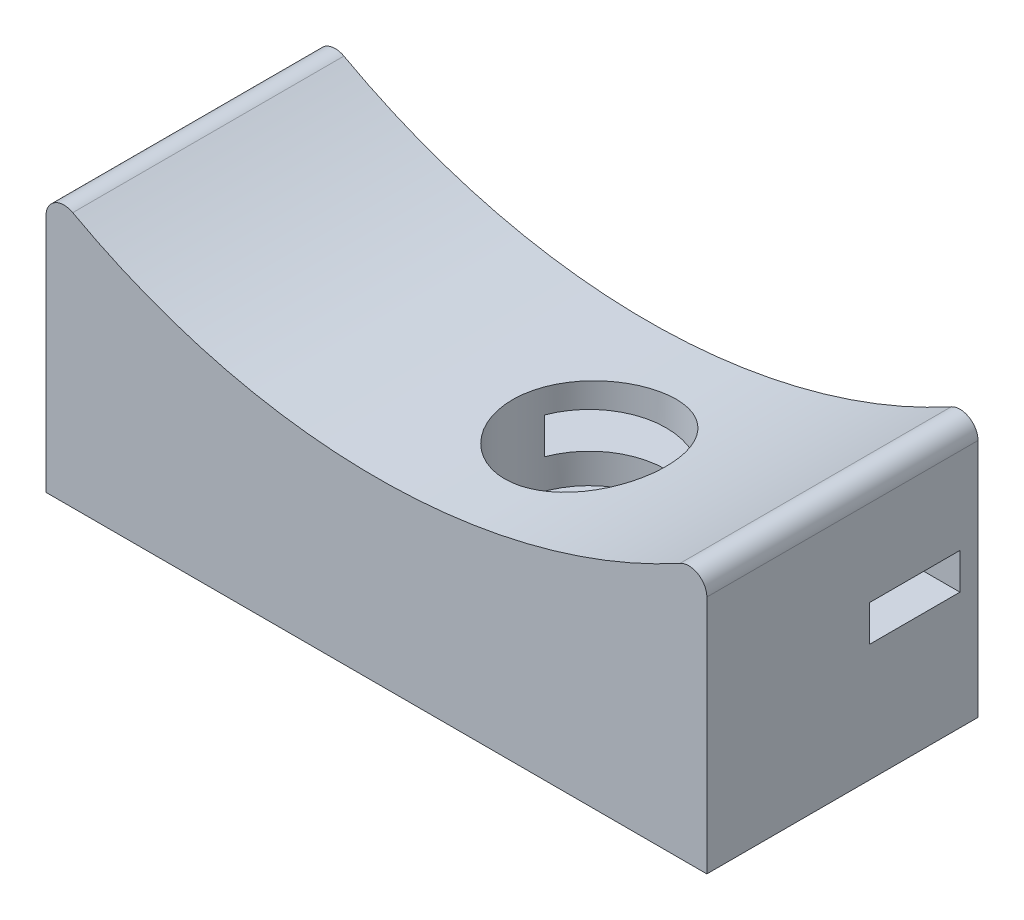
ISO-10303-21;
HEADER;
FILE_DESCRIPTION(('STEP AP214'),'2;1');
FILE_NAME('part.step','',(''),(''),'','','');
FILE_SCHEMA(('AUTOMOTIVE_DESIGN { 1 0 10303 214 1 1 1 1 }'));
ENDSEC;
DATA;
#1=APPLICATION_CONTEXT('core data for automotive mechanical design processes');
#2=APPLICATION_PROTOCOL_DEFINITION('international standard','automotive_design',2000,#1);
#3=PRODUCT_CONTEXT('',#1,'mechanical');
#4=PRODUCT('Part','Part','',(#3));
#5=PRODUCT_RELATED_PRODUCT_CATEGORY('part','',(#4));
#6=PRODUCT_DEFINITION_FORMATION('','',#4);
#7=PRODUCT_DEFINITION_CONTEXT('part definition',#1,'design');
#8=PRODUCT_DEFINITION('design','',#6,#7);
#9=PRODUCT_DEFINITION_SHAPE('','',#8);
#10=(LENGTH_UNIT() NAMED_UNIT(*) SI_UNIT(.MILLI.,.METRE.));
#11=(NAMED_UNIT(*) PLANE_ANGLE_UNIT() SI_UNIT($,.RADIAN.));
#12=(NAMED_UNIT(*) SI_UNIT($,.STERADIAN.) SOLID_ANGLE_UNIT());
#13=UNCERTAINTY_MEASURE_WITH_UNIT(LENGTH_MEASURE(1.E-05),#10,'distance_accuracy_value','');
#14=(GEOMETRIC_REPRESENTATION_CONTEXT(3) GLOBAL_UNCERTAINTY_ASSIGNED_CONTEXT((#13)) GLOBAL_UNIT_ASSIGNED_CONTEXT((#10,
#11,#12)) REPRESENTATION_CONTEXT('',''));
#15=CARTESIAN_POINT('',(0.,0.,0.));
#16=DIRECTION('',(0.,0.,1.));
#17=DIRECTION('',(1.,0.,0.));
#18=AXIS2_PLACEMENT_3D('',#15,#16,#17);
#19=CARTESIAN_POINT('',(22.5590515005411,15.,7.5));
#20=DIRECTION('',(0.,-1.,0.));
#21=DIRECTION('',(0.,0.,-1.));
#22=AXIS2_PLACEMENT_3D('',#19,#20,#21);
#23=CYLINDRICAL_SURFACE('',#22,2.5);
#24=CARTESIAN_POINT('',(22.5590515005411,0.,7.5));
#25=DIRECTION('',(0.,-1.,0.));
#26=DIRECTION('',(0.,0.,-1.));
#27=AXIS2_PLACEMENT_3D('',#24,#25,#26);
#28=CIRCLE('',#27,2.5);
#29=CARTESIAN_POINT('',(22.5590515005411,0.,5.));
#30=VERTEX_POINT('',#29);
#31=EDGE_CURVE('E175',#30,#30,#28,.T.);
#32=ORIENTED_EDGE('',*,*,#31,.T.);
#33=EDGE_LOOP('',(#32));
#34=FACE_BOUND('',#33,.T.);
#35=CARTESIAN_POINT('',(22.5590515005411,4.84726014804704,7.5));
#36=DIRECTION('',(0.,1.,0.));
#37=DIRECTION('',(0.,0.,1.));
#38=AXIS2_PLACEMENT_3D('',#35,#36,#37);
#39=CIRCLE('',#38,2.5);
#40=CARTESIAN_POINT('',(22.5590515005411,4.84726014804704,10.));
#41=VERTEX_POINT('',#40);
#42=EDGE_CURVE('E174',#41,#41,#39,.F.);
#43=ORIENTED_EDGE('',*,*,#42,.F.);
#44=EDGE_LOOP('',(#43));
#45=FACE_BOUND('',#44,.T.);
#46=ADVANCED_FACE('F33',(#34,#45),#23,.F.);
#47=CARTESIAN_POINT('',(0.,0.,15.));
#48=DIRECTION('',(0.,1.,0.));
#49=DIRECTION('',(0.,0.,1.));
#50=AXIS2_PLACEMENT_3D('',#47,#48,#49);
#51=PLANE('',#50);
#52=ORIENTED_EDGE('',*,*,#31,.F.);
#53=EDGE_LOOP('',(#52));
#54=FACE_BOUND('',#53,.T.);
#55=DIRECTION('',(1.,0.,0.));
#56=VECTOR('',#55,1.);
#57=CARTESIAN_POINT('',(0.,0.,0.));
#58=LINE('',#57,#56);
#59=CARTESIAN_POINT('',(0.,0.,0.));
#60=VERTEX_POINT('',#59);
#61=CARTESIAN_POINT('',(36.5590515005411,0.,0.));
#62=VERTEX_POINT('',#61);
#63=EDGE_CURVE('E178',#60,#62,#58,.T.);
#64=ORIENTED_EDGE('',*,*,#63,.T.);
#65=DIRECTION('',(0.,0.,-1.));
#66=VECTOR('',#65,1.);
#67=CARTESIAN_POINT('',(36.5590515005411,0.,15.));
#68=LINE('',#67,#66);
#69=CARTESIAN_POINT('',(36.5590515005411,0.,15.));
#70=VERTEX_POINT('',#69);
#71=EDGE_CURVE('E200',#70,#62,#68,.T.);
#72=ORIENTED_EDGE('',*,*,#71,.F.);
#73=DIRECTION('',(1.,0.,0.));
#74=VECTOR('',#73,1.);
#75=CARTESIAN_POINT('',(0.,0.,15.));
#76=LINE('',#75,#74);
#77=CARTESIAN_POINT('',(0.,0.,15.));
#78=VERTEX_POINT('',#77);
#79=EDGE_CURVE('E180',#78,#70,#76,.T.);
#80=ORIENTED_EDGE('',*,*,#79,.F.);
#81=DIRECTION('',(0.,0.,-1.));
#82=VECTOR('',#81,1.);
#83=CARTESIAN_POINT('',(0.,0.,15.));
#84=LINE('',#83,#82);
#85=EDGE_CURVE('E190',#78,#60,#84,.T.);
#86=ORIENTED_EDGE('',*,*,#85,.T.);
#87=EDGE_LOOP('',(#64,#72,#80,#86));
#88=FACE_BOUND('',#87,.T.);
#89=ADVANCED_FACE('F228',(#54,#88),#51,.F.);
#90=CARTESIAN_POINT('',(36.5590515005411,0.,15.));
#91=DIRECTION('',(-1.,0.,0.));
#92=DIRECTION('',(0.,0.,1.));
#93=AXIS2_PLACEMENT_3D('',#90,#91,#92);
#94=PLANE('',#93);
#95=DIRECTION('',(0.,0.,-1.));
#96=VECTOR('',#95,1.);
#97=CARTESIAN_POINT('',(36.5590515005411,6.5,6.));
#98=LINE('',#97,#96);
#99=CARTESIAN_POINT('',(36.5590515005411,6.5,6.));
#100=VERTEX_POINT('',#99);
#101=CARTESIAN_POINT('',(36.5590515005411,6.5,1.));
#102=VERTEX_POINT('',#101);
#103=EDGE_CURVE('E161',#100,#102,#98,.T.);
#104=ORIENTED_EDGE('',*,*,#103,.F.);
#105=DIRECTION('',(0.,-1.,0.));
#106=VECTOR('',#105,1.);
#107=CARTESIAN_POINT('',(36.5590515005411,8.5,6.));
#108=LINE('',#107,#106);
#109=CARTESIAN_POINT('',(36.5590515005411,8.5,6.));
#110=VERTEX_POINT('',#109);
#111=EDGE_CURVE('E159',#110,#100,#108,.T.);
#112=ORIENTED_EDGE('',*,*,#111,.F.);
#113=DIRECTION('',(0.,0.,1.));
#114=VECTOR('',#113,1.);
#115=CARTESIAN_POINT('',(36.5590515005411,8.5,6.));
#116=LINE('',#115,#114);
#117=CARTESIAN_POINT('',(36.5590515005411,8.5,1.));
#118=VERTEX_POINT('',#117);
#119=EDGE_CURVE('E151',#118,#110,#116,.T.);
#120=ORIENTED_EDGE('',*,*,#119,.F.);
#121=DIRECTION('',(0.,1.,0.));
#122=VECTOR('',#121,1.);
#123=CARTESIAN_POINT('',(36.5590515005411,8.5,1.));
#124=LINE('',#123,#122);
#125=EDGE_CURVE('E154',#102,#118,#124,.T.);
#126=ORIENTED_EDGE('',*,*,#125,.F.);
#127=EDGE_LOOP('',(#104,#112,#120,#126));
#128=FACE_BOUND('',#127,.T.);
#129=DIRECTION('',(0.,1.,0.));
#130=VECTOR('',#129,1.);
#131=CARTESIAN_POINT('',(36.5590515005411,0.,0.));
#132=LINE('',#131,#130);
#133=CARTESIAN_POINT('',(36.5590515005411,13.2653350983333,0.));
#134=VERTEX_POINT('',#133);
#135=EDGE_CURVE('E193',#62,#134,#132,.T.);
#136=ORIENTED_EDGE('',*,*,#135,.T.);
#137=DIRECTION('',(0.,0.,-1.));
#138=VECTOR('',#137,1.);
#139=CARTESIAN_POINT('',(36.5590515005411,13.2653350983333,15.));
#140=LINE('',#139,#138);
#141=CARTESIAN_POINT('',(36.5590515005411,13.2653350983333,15.));
#142=VERTEX_POINT('',#141);
#143=EDGE_CURVE('E11',#134,#142,#140,.F.);
#144=ORIENTED_EDGE('',*,*,#143,.T.);
#145=DIRECTION('',(0.,1.,0.));
#146=VECTOR('',#145,1.);
#147=CARTESIAN_POINT('',(36.5590515005411,0.,15.));
#148=LINE('',#147,#146);
#149=EDGE_CURVE('E183',#70,#142,#148,.T.);
#150=ORIENTED_EDGE('',*,*,#149,.F.);
#151=ORIENTED_EDGE('',*,*,#71,.T.);
#152=EDGE_LOOP('',(#136,#144,#150,#151));
#153=FACE_BOUND('',#152,.T.);
#154=ADVANCED_FACE('F240',(#128,#153),#94,.F.);
#155=CARTESIAN_POINT('',(18.2795257502705,44.847260148047,15.));
#156=DIRECTION('',(0.,0.,-1.));
#157=DIRECTION('',(-1.,0.,0.));
#158=AXIS2_PLACEMENT_3D('',#155,#156,#157);
#159=CYLINDRICAL_SURFACE('',#158,35.);
#160=CARTESIAN_POINT('',(22.5590515005411,10.1098788513406,11.75));
#161=CARTESIAN_POINT('',(22.3221743707647,10.0806994580656,11.7499906143347));
#162=CARTESIAN_POINT('',(22.0848605017005,10.0539451522141,11.7301337768942));
#163=CARTESIAN_POINT('',(21.6161935817004,10.0058725930809,11.650914635095));
#164=CARTESIAN_POINT('',(21.3848459618008,9.98455914574023,11.5915175705322));
#165=CARTESIAN_POINT('',(20.9349684367192,9.94740951388246,11.4346633956122));
#166=CARTESIAN_POINT('',(20.7164373098639,9.93157280661326,11.3372099196118));
#167=CARTESIAN_POINT('',(20.2986128893719,9.90491949281474,11.1069124399907));
#168=CARTESIAN_POINT('',(20.0993162112122,9.89410200181625,10.9740746781673));
#169=CARTESIAN_POINT('',(19.7264470806026,9.87668416862228,10.6773267720302));
#170=CARTESIAN_POINT('',(19.5527778469913,9.87006763161966,10.5135391504549));
#171=CARTESIAN_POINT('',(19.2352191447594,9.85994879239747,10.1591813530438));
#172=CARTESIAN_POINT('',(19.0913306811841,9.8564465952679,9.96861027368061));
#173=CARTESIAN_POINT('',(18.8372284277434,9.85147177481219,9.56575393408776));
#174=CARTESIAN_POINT('',(18.7270688788418,9.8500024073591,9.3534344232773));
#175=CARTESIAN_POINT('',(18.5438583261397,9.84813774627985,8.91334258550642));
#176=CARTESIAN_POINT('',(18.470807643703,9.84774246195514,8.68557012474242));
#177=CARTESIAN_POINT('',(18.363765169092,9.8473200637045,8.22050644195241));
#178=CARTESIAN_POINT('',(18.3298577674319,9.84729374388816,7.98319579093723));
#179=CARTESIAN_POINT('',(18.302348518858,9.84726477745339,7.50624975851777));
#180=CARTESIAN_POINT('',(18.3087467819203,9.84726213089955,7.2666143707721));
#181=CARTESIAN_POINT('',(18.3616782607073,9.84734676580723,6.79171842716234));
#182=CARTESIAN_POINT('',(18.4082278455025,9.84743408394879,6.55645969555941));
#183=CARTESIAN_POINT('',(18.5401629850781,9.84816897077554,6.09709553603858));
#184=CARTESIAN_POINT('',(18.625548751546,9.84881654251457,5.87299016892259));
#185=CARTESIAN_POINT('',(18.8327206146216,9.85147965444885,5.44231870617594));
#186=CARTESIAN_POINT('',(18.9545036416177,9.85349507930258,5.23575113335759));
#187=CARTESIAN_POINT('',(19.2309973693626,9.85992303877721,4.84601446323313));
#188=CARTESIAN_POINT('',(19.3857077186771,9.86433554781474,4.66284511623042));
#189=CARTESIAN_POINT('',(19.7233771927081,9.87664781233252,4.32535800536143));
#190=CARTESIAN_POINT('',(19.9062973127477,9.8845427803583,4.17100104528994));
#191=CARTESIAN_POINT('',(20.2952441371378,9.90481127597881,3.89521048710581));
#192=CARTESIAN_POINT('',(20.5012701527503,9.91718467010556,3.77377590801489));
#193=CARTESIAN_POINT('',(20.9298755229569,9.94709361776208,3.56748098021077));
#194=CARTESIAN_POINT('',(21.1524107618569,9.96461575967485,3.48252700343814));
#195=CARTESIAN_POINT('',(21.6080600008577,10.0051428004105,3.35098230418043));
#196=CARTESIAN_POINT('',(21.8411739838947,10.0281476903897,3.30439151981637));
#197=CARTESIAN_POINT('',(22.3118003007556,10.07950360782,3.25057876991754));
#198=CARTESIAN_POINT('',(22.5493206437473,10.1078654558016,3.24343738709307));
#199=CARTESIAN_POINT('',(23.0216532262701,10.1691840191118,3.26863542319066));
#200=CARTESIAN_POINT('',(23.2564652862969,10.2021410371336,3.30097744405478));
#201=CARTESIAN_POINT('',(23.7196586532241,10.271828773992,3.40458070618681));
#202=CARTESIAN_POINT('',(23.9479346402495,10.308598611364,3.47628624843781));
#203=CARTESIAN_POINT('',(24.389031480047,10.3838874594451,3.65676261261404));
#204=CARTESIAN_POINT('',(24.601850769364,10.4224066464632,3.76553717777831));
#205=CARTESIAN_POINT('',(25.0090827163155,10.4996745071412,4.01889046228363));
#206=CARTESIAN_POINT('',(25.2032074140164,10.5384192357667,4.16393364413737));
#207=CARTESIAN_POINT('',(25.5643248086681,10.6132744802269,4.4851648867747));
#208=CARTESIAN_POINT('',(25.7313168672696,10.6493849340742,4.66135368011715));
#209=CARTESIAN_POINT('',(26.0330786889367,10.7165358446644,5.03989218168159));
#210=CARTESIAN_POINT('',(26.1678951972847,10.7475836354989,5.24220327174953));
#211=CARTESIAN_POINT('',(26.4014008236952,10.8024426023446,5.66759837276213));
#212=CARTESIAN_POINT('',(26.5000953094615,10.826254853462,5.89067929114176));
#213=CARTESIAN_POINT('',(26.656287701093,10.8643788767166,6.34597416853419));
#214=CARTESIAN_POINT('',(26.7146592923736,10.8788916039618,6.57787140473324));
#215=CARTESIAN_POINT('',(26.7917265897387,10.8981209526115,7.0485528545959));
#216=CARTESIAN_POINT('',(26.8104288867992,10.9028392013467,7.28733591750938));
#217=CARTESIAN_POINT('',(26.8075503190011,10.9021164586217,7.7588872426851));
#218=CARTESIAN_POINT('',(26.7869252842389,10.8969165224743,7.99166234784057));
#219=CARTESIAN_POINT('',(26.7079740511533,10.8772308488072,8.45030962607879));
#220=CARTESIAN_POINT('',(26.6496483786253,10.8627452407911,8.67618189538658));
#221=CARTESIAN_POINT('',(26.4972452056895,10.8255731684741,9.11461042586348));
#222=CARTESIAN_POINT('',(26.4031911530275,10.8028920831592,9.32717531403012));
#223=CARTESIAN_POINT('',(26.1822019987229,10.7509181099307,9.73356080252512));
#224=CARTESIAN_POINT('',(26.0552641656987,10.7216246728103,9.92737984395472));
#225=CARTESIAN_POINT('',(25.7688666839707,10.6576165065078,10.2955712588016));
#226=CARTESIAN_POINT('',(25.6087303094932,10.6227932139935,10.4693982063292));
#227=CARTESIAN_POINT('',(25.2622172086285,10.5504192111565,10.787979836695));
#228=CARTESIAN_POINT('',(25.0758314530873,10.5128675645067,10.9327244741712));
#229=CARTESIAN_POINT('',(24.6770789921825,10.436310290274,11.1924837399061));
#230=CARTESIAN_POINT('',(24.4641972011843,10.3972913745862,11.3067038390056));
#231=CARTESIAN_POINT('',(24.0220859657379,10.3208478541487,11.4974849420435));
#232=CARTESIAN_POINT('',(23.7928728381413,10.2834217161478,11.5740829469413));
#233=CARTESIAN_POINT('',(23.3954740774339,10.2227822665835,11.6702707852598));
#234=CARTESIAN_POINT('',(23.229827040264,10.1986970138293,11.700099814631));
#235=CARTESIAN_POINT('',(22.895877503643,10.1526249889298,11.7399676691595));
#236=CARTESIAN_POINT('',(22.7275750287626,10.1306381973809,11.7500066773244));
#237=CARTESIAN_POINT('',(22.5590515005411,10.1098788513406,11.75));
#238=B_SPLINE_CURVE_WITH_KNOTS('',3,(#160,#161,#162,#163,#164,#165,#166,#167,#168,#169,#170,
#171,#172,#173,#174,#175,#176,#177,#178,#179,#180,#181,#182,#183,#184,#185,#186,#187,#188,#189,
#190,#191,#192,#193,#194,#195,#196,#197,#198,#199,#200,#201,#202,#203,#204,#205,#206,#207,#208,
#209,#210,#211,#212,#213,#214,#215,#216,#217,#218,#219,#220,#221,#222,#223,#224,#225,#226,#227,
#228,#229,#230,#231,#232,#233,#234,#235,#236,#237),.UNSPECIFIED.,.T.,.F.,(4,2,2,2,2,2,2,2,2,2,2,
2,2,2,2,2,2,2,2,2,2,2,2,2,2,2,2,2,2,2,2,2,2,2,2,2,2,2,4),(0.,0.715394740660666,1.43141922390441,
2.14737534409884,2.86320525298828,3.57625858688683,4.28933598108091,5.00355415562105,
5.71777851520314,6.43353983984135,7.14930311747303,7.86535833867853,8.58141746298975,
9.29741621452773,10.0134073245725,10.7284171902169,11.4434057485854,12.156548147474,
12.8696893960774,13.5842868306114,14.2989313594008,15.0218131551657,15.7447679693523,
16.4775031450316,17.2102555572669,17.9419368419688,18.6735093552266,19.388686627586,
20.1037450653221,20.8016456093707,21.4995364202936,22.1969700099788,22.8944615482456,
23.6078876197923,24.3215596948076,25.0523138899581,25.7823479492399,26.2913120724522,
26.8002714890116),.UNSPECIFIED.);
#239=CARTESIAN_POINT('',(22.5590515005411,10.1098788513406,11.75));
#240=VERTEX_POINT('',#239);
#241=EDGE_CURVE('E179',#240,#240,#238,.T.);
#242=ORIENTED_EDGE('',*,*,#241,.T.);
#243=EDGE_LOOP('',(#242));
#244=FACE_BOUND('',#243,.T.);
#245=CARTESIAN_POINT('',(18.2795257502705,44.847260148047,0.));
#246=DIRECTION('',(0.,0.,-1.));
#247=DIRECTION('',(1.,0.,0.));
#248=AXIS2_PLACEMENT_3D('',#245,#246,#247);
#249=CIRCLE('',#248,35.);
#250=CARTESIAN_POINT('',(35.0790646741447,14.1426107941587,0.));
#251=VERTEX_POINT('',#250);
#252=CARTESIAN_POINT('',(1.4799868263964,14.1426107941587,0.));
#253=VERTEX_POINT('',#252);
#254=EDGE_CURVE('E195',#251,#253,#249,.T.);
#255=ORIENTED_EDGE('',*,*,#254,.T.);
#256=DIRECTION('',(0.,0.,-1.));
#257=VECTOR('',#256,1.);
#258=CARTESIAN_POINT('',(1.4799868263964,14.1426107941587,15.));
#259=LINE('',#258,#257);
#260=CARTESIAN_POINT('',(1.4799868263964,14.1426107941587,15.));
#261=VERTEX_POINT('',#260);
#262=EDGE_CURVE('E54',#253,#261,#259,.F.);
#263=ORIENTED_EDGE('',*,*,#262,.T.);
#264=CARTESIAN_POINT('',(18.2795257502705,44.847260148047,15.));
#265=DIRECTION('',(0.,0.,-1.));
#266=DIRECTION('',(1.,0.,0.));
#267=AXIS2_PLACEMENT_3D('',#264,#265,#266);
#268=CIRCLE('',#267,35.);
#269=CARTESIAN_POINT('',(35.0790646741447,14.1426107941587,15.));
#270=VERTEX_POINT('',#269);
#271=EDGE_CURVE('E186',#270,#261,#268,.T.);
#272=ORIENTED_EDGE('',*,*,#271,.F.);
#273=DIRECTION('',(0.,0.,-1.));
#274=VECTOR('',#273,1.);
#275=CARTESIAN_POINT('',(35.0790646741447,14.1426107941587,15.));
#276=LINE('',#275,#274);
#277=EDGE_CURVE('E250',#270,#251,#276,.T.);
#278=ORIENTED_EDGE('',*,*,#277,.T.);
#279=EDGE_LOOP('',(#255,#263,#272,#278));
#280=FACE_BOUND('',#279,.T.);
#281=ADVANCED_FACE('F213',(#244,#280),#159,.F.);
#282=CARTESIAN_POINT('',(0.,15.,15.));
#283=DIRECTION('',(1.,0.,0.));
#284=DIRECTION('',(0.,1.,0.));
#285=AXIS2_PLACEMENT_3D('',#282,#283,#284);
#286=PLANE('',#285);
#287=DIRECTION('',(0.,0.,1.));
#288=VECTOR('',#287,1.);
#289=CARTESIAN_POINT('',(0.,8.5,6.));
#290=LINE('',#289,#288);
#291=CARTESIAN_POINT('',(0.,8.5,1.));
#292=VERTEX_POINT('',#291);
#293=CARTESIAN_POINT('',(0.,8.5,6.));
#294=VERTEX_POINT('',#293);
#295=EDGE_CURVE('E150',#292,#294,#290,.T.);
#296=ORIENTED_EDGE('',*,*,#295,.T.);
#297=DIRECTION('',(0.,-1.,0.));
#298=VECTOR('',#297,1.);
#299=CARTESIAN_POINT('',(0.,8.5,6.));
#300=LINE('',#299,#298);
#301=CARTESIAN_POINT('',(0.,6.5,6.));
#302=VERTEX_POINT('',#301);
#303=EDGE_CURVE('E128',#294,#302,#300,.T.);
#304=ORIENTED_EDGE('',*,*,#303,.T.);
#305=DIRECTION('',(0.,0.,-1.));
#306=VECTOR('',#305,1.);
#307=CARTESIAN_POINT('',(0.,6.5,6.));
#308=LINE('',#307,#306);
#309=CARTESIAN_POINT('',(0.,6.5,0.999999999999999));
#310=VERTEX_POINT('',#309);
#311=EDGE_CURVE('E139',#302,#310,#308,.T.);
#312=ORIENTED_EDGE('',*,*,#311,.T.);
#313=DIRECTION('',(0.,1.,0.));
#314=VECTOR('',#313,1.);
#315=CARTESIAN_POINT('',(0.,8.5,1.));
#316=LINE('',#315,#314);
#317=EDGE_CURVE('E145',#310,#292,#316,.T.);
#318=ORIENTED_EDGE('',*,*,#317,.T.);
#319=EDGE_LOOP('',(#296,#304,#312,#318));
#320=FACE_BOUND('',#319,.T.);
#321=DIRECTION('',(0.,-1.,0.));
#322=VECTOR('',#321,1.);
#323=CARTESIAN_POINT('',(0.,15.,15.));
#324=LINE('',#323,#322);
#325=CARTESIAN_POINT('',(0.,13.2653350983333,15.));
#326=VERTEX_POINT('',#325);
#327=EDGE_CURVE('E188',#326,#78,#324,.T.);
#328=ORIENTED_EDGE('',*,*,#327,.F.);
#329=DIRECTION('',(0.,0.,-1.));
#330=VECTOR('',#329,1.);
#331=CARTESIAN_POINT('',(0.,13.2653350983333,15.));
#332=LINE('',#331,#330);
#333=CARTESIAN_POINT('',(0.,13.2653350983333,0.));
#334=VERTEX_POINT('',#333);
#335=EDGE_CURVE('E264',#326,#334,#332,.T.);
#336=ORIENTED_EDGE('',*,*,#335,.T.);
#337=DIRECTION('',(0.,-1.,0.));
#338=VECTOR('',#337,1.);
#339=CARTESIAN_POINT('',(0.,15.,0.));
#340=LINE('',#339,#338);
#341=EDGE_CURVE('E184',#334,#60,#340,.T.);
#342=ORIENTED_EDGE('',*,*,#341,.T.);
#343=ORIENTED_EDGE('',*,*,#85,.F.);
#344=EDGE_LOOP('',(#328,#336,#342,#343));
#345=FACE_BOUND('',#344,.T.);
#346=ADVANCED_FACE('F147',(#320,#345),#286,.F.);
#347=CARTESIAN_POINT('',(18.2795257502705,44.847260148047,15.));
#348=DIRECTION('',(0.,0.,1.));
#349=DIRECTION('',(1.,0.,0.));
#350=AXIS2_PLACEMENT_3D('',#347,#348,#349);
#351=PLANE('',#350);
#352=ORIENTED_EDGE('',*,*,#271,.T.);
#353=CARTESIAN_POINT('',(1.,13.2653350983333,15.));
#354=DIRECTION('',(0.,0.,1.));
#355=DIRECTION('',(1.,0.,0.));
#356=AXIS2_PLACEMENT_3D('',#353,#354,#355);
#357=CIRCLE('',#356,1.);
#358=EDGE_CURVE('E41',#261,#326,#357,.T.);
#359=ORIENTED_EDGE('',*,*,#358,.T.);
#360=ORIENTED_EDGE('',*,*,#327,.T.);
#361=ORIENTED_EDGE('',*,*,#79,.T.);
#362=ORIENTED_EDGE('',*,*,#149,.T.);
#363=CARTESIAN_POINT('',(35.5590515005411,13.2653350983333,15.));
#364=DIRECTION('',(0.,0.,1.));
#365=DIRECTION('',(1.,0.,0.));
#366=AXIS2_PLACEMENT_3D('',#363,#364,#365);
#367=CIRCLE('',#366,1.);
#368=EDGE_CURVE('E257',#142,#270,#367,.T.);
#369=ORIENTED_EDGE('',*,*,#368,.T.);
#370=EDGE_LOOP('',(#352,#359,#360,#361,#362,#369));
#371=FACE_BOUND('',#370,.T.);
#372=ADVANCED_FACE('F230',(#371),#351,.T.);
#373=CARTESIAN_POINT('',(18.2795257502705,44.847260148047,0.));
#374=DIRECTION('',(0.,0.,1.));
#375=DIRECTION('',(1.,0.,0.));
#376=AXIS2_PLACEMENT_3D('',#373,#374,#375);
#377=PLANE('',#376);
#378=ORIENTED_EDGE('',*,*,#341,.F.);
#379=CARTESIAN_POINT('',(1.,13.2653350983333,0.));
#380=DIRECTION('',(0.,0.,1.));
#381=DIRECTION('',(1.,0.,0.));
#382=AXIS2_PLACEMENT_3D('',#379,#380,#381);
#383=CIRCLE('',#382,1.);
#384=EDGE_CURVE('E255',#334,#253,#383,.F.);
#385=ORIENTED_EDGE('',*,*,#384,.T.);
#386=ORIENTED_EDGE('',*,*,#254,.F.);
#387=CARTESIAN_POINT('',(35.5590515005411,13.2653350983333,0.));
#388=DIRECTION('',(0.,0.,1.));
#389=DIRECTION('',(1.,0.,0.));
#390=AXIS2_PLACEMENT_3D('',#387,#388,#389);
#391=CIRCLE('',#390,1.);
#392=EDGE_CURVE('E267',#251,#134,#391,.F.);
#393=ORIENTED_EDGE('',*,*,#392,.T.);
#394=ORIENTED_EDGE('',*,*,#135,.F.);
#395=ORIENTED_EDGE('',*,*,#63,.F.);
#396=EDGE_LOOP('',(#378,#385,#386,#393,#394,#395));
#397=FACE_BOUND('',#396,.T.);
#398=ADVANCED_FACE('F223',(#397),#377,.F.);
#399=CARTESIAN_POINT('',(22.5590515005411,4.84726014804704,7.5));
#400=DIRECTION('',(0.,1.,0.));
#401=DIRECTION('',(0.,0.,1.));
#402=AXIS2_PLACEMENT_3D('',#399,#400,#401);
#403=CYLINDRICAL_SURFACE('',#402,4.25000000000001);
#404=DIRECTION('',(0.,1.,0.));
#405=VECTOR('',#404,1.);
#406=CARTESIAN_POINT('',(18.5825580703943,4.84726014804704,6.));
#407=LINE('',#406,#405);
#408=CARTESIAN_POINT('',(18.5825580703943,6.5,6.));
#409=VERTEX_POINT('',#408);
#410=CARTESIAN_POINT('',(18.5825580703943,8.5,6.));
#411=VERTEX_POINT('',#410);
#412=EDGE_CURVE('E131',#409,#411,#407,.T.);
#413=ORIENTED_EDGE('',*,*,#412,.T.);
#414=CARTESIAN_POINT('',(22.5590515005411,8.5,7.5));
#415=DIRECTION('',(0.,1.,0.));
#416=DIRECTION('',(0.,0.,1.));
#417=AXIS2_PLACEMENT_3D('',#414,#415,#416);
#418=CIRCLE('',#417,4.25000000000001);
#419=CARTESIAN_POINT('',(26.5355449306878,8.5,6.));
#420=VERTEX_POINT('',#419);
#421=EDGE_CURVE('E268',#411,#420,#418,.F.);
#422=ORIENTED_EDGE('',*,*,#421,.T.);
#423=DIRECTION('',(0.,1.,0.));
#424=VECTOR('',#423,1.);
#425=CARTESIAN_POINT('',(26.5355449306878,4.84726014804704,6.));
#426=LINE('',#425,#424);
#427=CARTESIAN_POINT('',(26.5355449306878,6.5,6.));
#428=VERTEX_POINT('',#427);
#429=EDGE_CURVE('E272',#420,#428,#426,.F.);
#430=ORIENTED_EDGE('',*,*,#429,.T.);
#431=CARTESIAN_POINT('',(22.5590515005411,6.5,7.5));
#432=DIRECTION('',(0.,-1.,0.));
#433=DIRECTION('',(0.,0.,-1.));
#434=AXIS2_PLACEMENT_3D('',#431,#432,#433);
#435=CIRCLE('',#434,4.25000000000001);
#436=EDGE_CURVE('E203',#428,#409,#435,.F.);
#437=ORIENTED_EDGE('',*,*,#436,.T.);
#438=EDGE_LOOP('',(#413,#422,#430,#437));
#439=FACE_BOUND('',#438,.T.);
#440=CARTESIAN_POINT('',(22.5590515005411,4.84726014804704,7.5));
#441=DIRECTION('',(0.,1.,0.));
#442=DIRECTION('',(0.,0.,1.));
#443=AXIS2_PLACEMENT_3D('',#440,#441,#442);
#444=CIRCLE('',#443,4.25000000000001);
#445=CARTESIAN_POINT('',(22.5590515005411,4.84726014804704,11.75));
#446=VERTEX_POINT('',#445);
#447=EDGE_CURVE('E167',#446,#446,#444,.T.);
#448=ORIENTED_EDGE('',*,*,#447,.F.);
#449=EDGE_LOOP('',(#448));
#450=FACE_BOUND('',#449,.T.);
#451=ORIENTED_EDGE('',*,*,#241,.F.);
#452=EDGE_LOOP('',(#451));
#453=FACE_BOUND('',#452,.T.);
#454=ADVANCED_FACE('F217',(#439,#450,#453),#403,.F.);
#455=CARTESIAN_POINT('',(22.5590515005411,4.84726014804704,7.5));
#456=DIRECTION('',(0.,1.,0.));
#457=DIRECTION('',(0.,0.,1.));
#458=AXIS2_PLACEMENT_3D('',#455,#456,#457);
#459=PLANE('',#458);
#460=ORIENTED_EDGE('',*,*,#447,.T.);
#461=EDGE_LOOP('',(#460));
#462=FACE_BOUND('',#461,.T.);
#463=ORIENTED_EDGE('',*,*,#42,.T.);
#464=EDGE_LOOP('',(#463));
#465=FACE_BOUND('',#464,.T.);
#466=ADVANCED_FACE('F222',(#462,#465),#459,.T.);
#467=CARTESIAN_POINT('',(0.,8.5,6.));
#468=DIRECTION('',(0.,0.,1.));
#469=DIRECTION('',(0.,-1.,0.));
#470=AXIS2_PLACEMENT_3D('',#467,#468,#469);
#471=PLANE('',#470);
#472=DIRECTION('',(1.,0.,0.));
#473=VECTOR('',#472,1.);
#474=CARTESIAN_POINT('',(0.,8.5,6.));
#475=LINE('',#474,#473);
#476=EDGE_CURVE('E168',#420,#110,#475,.T.);
#477=ORIENTED_EDGE('',*,*,#476,.T.);
#478=ORIENTED_EDGE('',*,*,#111,.T.);
#479=DIRECTION('',(1.,0.,0.));
#480=VECTOR('',#479,1.);
#481=CARTESIAN_POINT('',(0.,6.5,6.));
#482=LINE('',#481,#480);
#483=EDGE_CURVE('E135',#428,#100,#482,.T.);
#484=ORIENTED_EDGE('',*,*,#483,.F.);
#485=ORIENTED_EDGE('',*,*,#429,.F.);
#486=EDGE_LOOP('',(#477,#478,#484,#485));
#487=FACE_BOUND('',#486,.T.);
#488=ADVANCED_FACE('F300',(#487),#471,.F.);
#489=EDGE_CURVE('E123',#302,#409,#482,.T.);
#490=ORIENTED_EDGE('',*,*,#489,.F.);
#491=ORIENTED_EDGE('',*,*,#303,.F.);
#492=EDGE_CURVE('E165',#294,#411,#475,.T.);
#493=ORIENTED_EDGE('',*,*,#492,.T.);
#494=ORIENTED_EDGE('',*,*,#412,.F.);
#495=EDGE_LOOP('',(#490,#491,#493,#494));
#496=FACE_BOUND('',#495,.T.);
#497=ADVANCED_FACE('F125',(#496),#471,.F.);
#498=CARTESIAN_POINT('',(0.,8.5,6.));
#499=DIRECTION('',(0.,1.,0.));
#500=DIRECTION('',(0.,0.,1.));
#501=AXIS2_PLACEMENT_3D('',#498,#499,#500);
#502=PLANE('',#501);
#503=ORIENTED_EDGE('',*,*,#492,.F.);
#504=ORIENTED_EDGE('',*,*,#295,.F.);
#505=DIRECTION('',(1.,0.,0.));
#506=VECTOR('',#505,1.);
#507=CARTESIAN_POINT('',(0.,8.5,1.));
#508=LINE('',#507,#506);
#509=EDGE_CURVE('E169',#292,#118,#508,.T.);
#510=ORIENTED_EDGE('',*,*,#509,.T.);
#511=ORIENTED_EDGE('',*,*,#119,.T.);
#512=ORIENTED_EDGE('',*,*,#476,.F.);
#513=ORIENTED_EDGE('',*,*,#421,.F.);
#514=EDGE_LOOP('',(#503,#504,#510,#511,#512,#513));
#515=FACE_BOUND('',#514,.T.);
#516=ADVANCED_FACE('F312',(#515),#502,.F.);
#517=CARTESIAN_POINT('',(0.,6.5,6.));
#518=DIRECTION('',(0.,-1.,0.));
#519=DIRECTION('',(0.,0.,-1.));
#520=AXIS2_PLACEMENT_3D('',#517,#518,#519);
#521=PLANE('',#520);
#522=ORIENTED_EDGE('',*,*,#483,.T.);
#523=ORIENTED_EDGE('',*,*,#103,.T.);
#524=DIRECTION('',(1.,0.,0.));
#525=VECTOR('',#524,1.);
#526=CARTESIAN_POINT('',(0.,6.5,1.));
#527=LINE('',#526,#525);
#528=EDGE_CURVE('E134',#310,#102,#527,.T.);
#529=ORIENTED_EDGE('',*,*,#528,.F.);
#530=ORIENTED_EDGE('',*,*,#311,.F.);
#531=ORIENTED_EDGE('',*,*,#489,.T.);
#532=ORIENTED_EDGE('',*,*,#436,.F.);
#533=EDGE_LOOP('',(#522,#523,#529,#530,#531,#532));
#534=FACE_BOUND('',#533,.T.);
#535=ADVANCED_FACE('F141',(#534),#521,.F.);
#536=CARTESIAN_POINT('',(0.,8.5,1.));
#537=DIRECTION('',(0.,0.,-1.));
#538=DIRECTION('',(0.,1.,0.));
#539=AXIS2_PLACEMENT_3D('',#536,#537,#538);
#540=PLANE('',#539);
#541=ORIENTED_EDGE('',*,*,#125,.T.);
#542=ORIENTED_EDGE('',*,*,#509,.F.);
#543=ORIENTED_EDGE('',*,*,#317,.F.);
#544=ORIENTED_EDGE('',*,*,#528,.T.);
#545=EDGE_LOOP('',(#541,#542,#543,#544));
#546=FACE_BOUND('',#545,.T.);
#547=ADVANCED_FACE('F284',(#546),#540,.F.);
#548=CARTESIAN_POINT('',(1.,13.2653350983333,15.));
#549=DIRECTION('',(0.,0.,-1.));
#550=DIRECTION('',(-1.,0.,0.));
#551=AXIS2_PLACEMENT_3D('',#548,#549,#550);
#552=CYLINDRICAL_SURFACE('',#551,1.);
#553=ORIENTED_EDGE('',*,*,#358,.F.);
#554=ORIENTED_EDGE('',*,*,#262,.F.);
#555=ORIENTED_EDGE('',*,*,#384,.F.);
#556=ORIENTED_EDGE('',*,*,#335,.F.);
#557=EDGE_LOOP('',(#553,#554,#555,#556));
#558=FACE_BOUND('',#557,.T.);
#559=ADVANCED_FACE('F253',(#558),#552,.T.);
#560=CARTESIAN_POINT('',(35.5590515005411,13.2653350983333,15.));
#561=DIRECTION('',(0.,0.,-1.));
#562=DIRECTION('',(-1.,0.,0.));
#563=AXIS2_PLACEMENT_3D('',#560,#561,#562);
#564=CYLINDRICAL_SURFACE('',#563,1.);
#565=ORIENTED_EDGE('',*,*,#368,.F.);
#566=ORIENTED_EDGE('',*,*,#143,.F.);
#567=ORIENTED_EDGE('',*,*,#392,.F.);
#568=ORIENTED_EDGE('',*,*,#277,.F.);
#569=EDGE_LOOP('',(#565,#566,#567,#568));
#570=FACE_BOUND('',#569,.T.);
#571=ADVANCED_FACE('F35',(#570),#564,.T.);
#572=CLOSED_SHELL('',(#46,#89,#154,#281,#346,#372,#398,#454,#466,#488,#497,#516,#535,#547,#559,#571));
#573=MANIFOLD_SOLID_BREP('B2',#572);
#574=ADVANCED_BREP_SHAPE_REPRESENTATION('',(#18,#573),#14);
#575=SHAPE_DEFINITION_REPRESENTATION(#9,#574);
ENDSEC;
END-ISO-10303-21;
